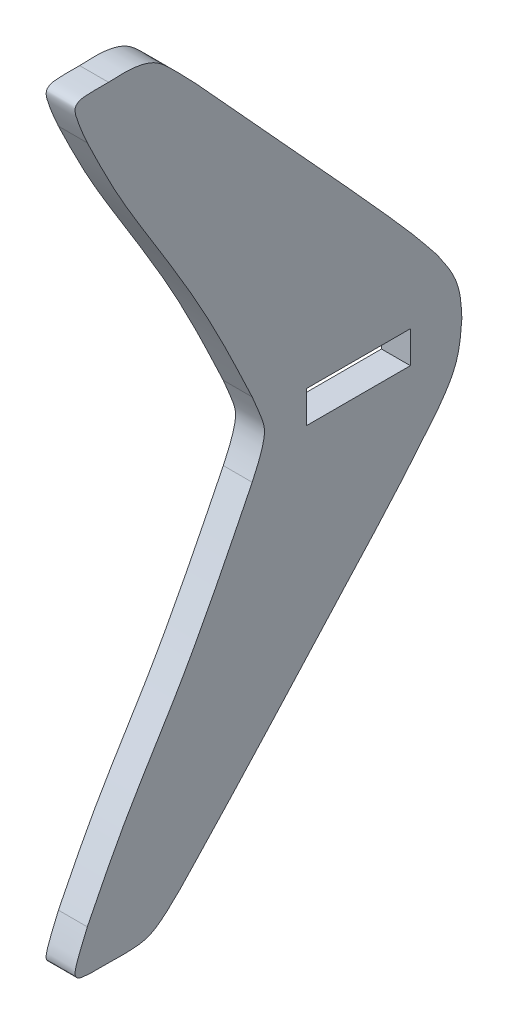
ISO-10303-21;
HEADER;
FILE_DESCRIPTION(('STEP AP214'),'2;1');
FILE_NAME('part.step','',(''),(''),'','','');
FILE_SCHEMA(('AUTOMOTIVE_DESIGN { 1 0 10303 214 1 1 1 1 }'));
ENDSEC;
DATA;
#1=APPLICATION_CONTEXT('core data for automotive mechanical design processes');
#2=APPLICATION_PROTOCOL_DEFINITION('international standard','automotive_design',2000,#1);
#3=PRODUCT_CONTEXT('',#1,'mechanical');
#4=PRODUCT('Part','Part','',(#3));
#5=PRODUCT_RELATED_PRODUCT_CATEGORY('part','',(#4));
#6=PRODUCT_DEFINITION_FORMATION('','',#4);
#7=PRODUCT_DEFINITION_CONTEXT('part definition',#1,'design');
#8=PRODUCT_DEFINITION('design','',#6,#7);
#9=PRODUCT_DEFINITION_SHAPE('','',#8);
#10=(LENGTH_UNIT() NAMED_UNIT(*) SI_UNIT(.MILLI.,.METRE.));
#11=(NAMED_UNIT(*) PLANE_ANGLE_UNIT() SI_UNIT($,.RADIAN.));
#12=(NAMED_UNIT(*) SI_UNIT($,.STERADIAN.) SOLID_ANGLE_UNIT());
#13=UNCERTAINTY_MEASURE_WITH_UNIT(LENGTH_MEASURE(1.E-05),#10,'distance_accuracy_value','');
#14=(GEOMETRIC_REPRESENTATION_CONTEXT(3) GLOBAL_UNCERTAINTY_ASSIGNED_CONTEXT((#13)) GLOBAL_UNIT_ASSIGNED_CONTEXT((#10,
#11,#12)) REPRESENTATION_CONTEXT('',''));
#15=CARTESIAN_POINT('',(0.,0.,0.));
#16=DIRECTION('',(0.,0.,1.));
#17=DIRECTION('',(1.,0.,0.));
#18=AXIS2_PLACEMENT_3D('',#15,#16,#17);
#19=CARTESIAN_POINT('',(2.7,-5.83093594704467E-06,-3.58855555751787));
#20=DIRECTION('',(0.,-1.62486991035192E-06,-0.99999999999868));
#21=DIRECTION('',(0.,0.99999999999868,-1.62486991035193E-06));
#22=AXIS2_PLACEMENT_3D('',#19,#20,#21);
#23=PLANE('',#22);
#24=DIRECTION('',(0.,-0.99999999999868,1.62486991035192E-06));
#25=VECTOR('',#24,1.);
#26=CARTESIAN_POINT('',(0.,-5.83093594704467E-06,-3.58855555751787));
#27=LINE('',#26,#25);
#28=CARTESIAN_POINT('',(0.,1.55675196931868,-3.58855808704678));
#29=VERTEX_POINT('',#28);
#30=CARTESIAN_POINT('',(0.,-1.44324803067736,-3.58855321243705));
#31=VERTEX_POINT('',#30);
#32=EDGE_CURVE('E315',#29,#31,#27,.T.);
#33=ORIENTED_EDGE('',*,*,#32,.F.);
#34=DIRECTION('',(-1.,0.,0.));
#35=VECTOR('',#34,1.);
#36=CARTESIAN_POINT('',(2.7,1.55675196931868,-3.58855808704678));
#37=LINE('',#36,#35);
#38=CARTESIAN_POINT('',(2.7,1.55675196931868,-3.58855808704678));
#39=VERTEX_POINT('',#38);
#40=EDGE_CURVE('E11',#39,#29,#37,.T.);
#41=ORIENTED_EDGE('',*,*,#40,.F.);
#42=DIRECTION('',(0.,-0.99999999999868,1.62486991035192E-06));
#43=VECTOR('',#42,1.);
#44=CARTESIAN_POINT('',(2.7,-5.83093594704467E-06,-3.58855555751787));
#45=LINE('',#44,#43);
#46=CARTESIAN_POINT('',(2.7,-1.44324803067736,-3.58855321243705));
#47=VERTEX_POINT('',#46);
#48=EDGE_CURVE('E192',#39,#47,#45,.T.);
#49=ORIENTED_EDGE('',*,*,#48,.T.);
#50=DIRECTION('',(-1.,0.,0.));
#51=VECTOR('',#50,1.);
#52=CARTESIAN_POINT('',(2.7,-1.44324803067736,-3.58855321243705));
#53=LINE('',#52,#51);
#54=EDGE_CURVE('E66',#47,#31,#53,.T.);
#55=ORIENTED_EDGE('',*,*,#54,.T.);
#56=EDGE_LOOP('',(#33,#41,#49,#55));
#57=FACE_BOUND('',#56,.T.);
#58=ADVANCED_FACE('F50',(#57),#23,.T.);
#59=CARTESIAN_POINT('',(2.7,1.5603480534542,-0.00156430237065756));
#60=DIRECTION('',(0.,-0.999999497462914,0.0010025337494892));
#61=DIRECTION('',(0.,-0.0010025337494892,-0.999999497462914));
#62=AXIS2_PLACEMENT_3D('',#59,#60,#61);
#63=PLANE('',#62);
#64=DIRECTION('',(0.,0.0010025337494892,0.999999497462914));
#65=VECTOR('',#64,1.);
#66=CARTESIAN_POINT('',(0.,1.5603480534542,-0.00156430237065756));
#67=LINE('',#66,#65);
#68=CARTESIAN_POINT('',(0.,1.54702739194864,-13.288553212437));
#69=VERTEX_POINT('',#68);
#70=EDGE_CURVE('E177',#69,#29,#67,.T.);
#71=ORIENTED_EDGE('',*,*,#70,.F.);
#72=DIRECTION('',(-1.,0.,0.));
#73=VECTOR('',#72,1.);
#74=CARTESIAN_POINT('',(2.7,1.54702739194864,-13.288553212437));
#75=LINE('',#74,#73);
#76=CARTESIAN_POINT('',(2.7,1.54702739194864,-13.288553212437));
#77=VERTEX_POINT('',#76);
#78=EDGE_CURVE('E56',#77,#69,#75,.T.);
#79=ORIENTED_EDGE('',*,*,#78,.F.);
#80=DIRECTION('',(0.,0.0010025337494892,0.999999497462914));
#81=VECTOR('',#80,1.);
#82=CARTESIAN_POINT('',(2.7,1.5603480534542,-0.00156430237065756));
#83=LINE('',#82,#81);
#84=EDGE_CURVE('E180',#77,#39,#83,.T.);
#85=ORIENTED_EDGE('',*,*,#84,.T.);
#86=ORIENTED_EDGE('',*,*,#40,.T.);
#87=EDGE_LOOP('',(#71,#79,#85,#86));
#88=FACE_BOUND('',#87,.T.);
#89=ADVANCED_FACE('F176',(#88),#63,.T.);
#90=CARTESIAN_POINT('',(2.7,0.,-13.288553212437));
#91=DIRECTION('',(0.,0.,1.));
#92=DIRECTION('',(1.,0.,0.));
#93=AXIS2_PLACEMENT_3D('',#90,#91,#92);
#94=PLANE('',#93);
#95=DIRECTION('',(0.,1.,0.));
#96=VECTOR('',#95,1.);
#97=CARTESIAN_POINT('',(0.,0.,-13.288553212437));
#98=LINE('',#97,#96);
#99=CARTESIAN_POINT('',(0.,-1.44324803067736,-13.288553212437));
#100=VERTEX_POINT('',#99);
#101=EDGE_CURVE('E319',#100,#69,#98,.T.);
#102=ORIENTED_EDGE('',*,*,#101,.F.);
#103=DIRECTION('',(-1.,0.,0.));
#104=VECTOR('',#103,1.);
#105=CARTESIAN_POINT('',(2.7,-1.44324803067736,-13.288553212437));
#106=LINE('',#105,#104);
#107=CARTESIAN_POINT('',(2.7,-1.44324803067736,-13.288553212437));
#108=VERTEX_POINT('',#107);
#109=EDGE_CURVE('E120',#108,#100,#106,.T.);
#110=ORIENTED_EDGE('',*,*,#109,.F.);
#111=DIRECTION('',(0.,1.,0.));
#112=VECTOR('',#111,1.);
#113=CARTESIAN_POINT('',(2.7,0.,-13.288553212437));
#114=LINE('',#113,#112);
#115=EDGE_CURVE('E189',#108,#77,#114,.T.);
#116=ORIENTED_EDGE('',*,*,#115,.T.);
#117=ORIENTED_EDGE('',*,*,#78,.T.);
#118=EDGE_LOOP('',(#102,#110,#116,#117));
#119=FACE_BOUND('',#118,.T.);
#120=ADVANCED_FACE('F191',(#119),#94,.T.);
#121=CARTESIAN_POINT('',(2.7,6.29343922792252,-15.7755224845044));
#122=CARTESIAN_POINT('',(2.7,5.12196214240405,-16.5936325073022));
#123=CARTESIAN_POINT('',(2.7,3.19413783871315,-17.9399434207116));
#124=CARTESIAN_POINT('',(2.7,0.87125498487653,-18.0568562266129));
#125=CARTESIAN_POINT('',(2.7,-0.0400863553463055,-18.1027248648197));
#126=B_SPLINE_CURVE_WITH_KNOTS('',3,(#121,#122,#123,#124,#125),.UNSPECIFIED.,.F.,.F.,(4,1,4),
(0.,0.607667972270947,1.),.UNSPECIFIED.);
#127=DIRECTION('',(-1.,0.,0.));
#128=VECTOR('',#127,1.);
#129=SURFACE_OF_LINEAR_EXTRUSION('',#126,#128);
#130=CARTESIAN_POINT('',(0.,6.29343922792252,-15.7755224845044));
#131=CARTESIAN_POINT('',(0.,5.12196214240405,-16.5936325073022));
#132=CARTESIAN_POINT('',(0.,3.19413783871315,-17.9399434207116));
#133=CARTESIAN_POINT('',(0.,0.87125498487653,-18.0568562266129));
#134=CARTESIAN_POINT('',(0.,-0.0400863553463055,-18.1027248648197));
#135=B_SPLINE_CURVE_WITH_KNOTS('',3,(#130,#131,#132,#133,#134),.UNSPECIFIED.,.F.,.F.,(4,1,4),
(0.,0.607667972270947,1.),.UNSPECIFIED.);
#136=CARTESIAN_POINT('',(0.,6.2934392279225,-15.7755224845044));
#137=VERTEX_POINT('',#136);
#138=CARTESIAN_POINT('',(0.,-0.0400863553463055,-18.1027248648197));
#139=VERTEX_POINT('',#138);
#140=EDGE_CURVE('E201',#137,#139,#135,.T.);
#141=ORIENTED_EDGE('',*,*,#140,.F.);
#142=DIRECTION('',(-1.,0.,0.));
#143=VECTOR('',#142,1.);
#144=CARTESIAN_POINT('',(2.7,6.2934392279225,-15.7755224845044));
#145=LINE('',#144,#143);
#146=CARTESIAN_POINT('',(2.7,6.2934392279225,-15.7755224845044));
#147=VERTEX_POINT('',#146);
#148=EDGE_CURVE('E55',#147,#137,#145,.T.);
#149=ORIENTED_EDGE('',*,*,#148,.F.);
#150=CARTESIAN_POINT('',(2.7,-0.0400863553463055,-18.1027248648197));
#151=VERTEX_POINT('',#150);
#152=EDGE_CURVE('E330',#147,#151,#126,.T.);
#153=ORIENTED_EDGE('',*,*,#152,.T.);
#154=DIRECTION('',(-1.,0.,0.));
#155=VECTOR('',#154,1.);
#156=CARTESIAN_POINT('',(2.7,-0.0400863553463055,-18.1027248648197));
#157=LINE('',#156,#155);
#158=EDGE_CURVE('E198',#151,#139,#157,.T.);
#159=ORIENTED_EDGE('',*,*,#158,.T.);
#160=EDGE_LOOP('',(#141,#149,#153,#159));
#161=FACE_BOUND('',#160,.T.);
#162=ADVANCED_FACE('F47',(#161),#129,.T.);
#163=CARTESIAN_POINT('',(2.7,15.8686335020383,-7.45162996259253));
#164=CARTESIAN_POINT('',(2.7,14.6607903775899,-8.53957417363261));
#165=CARTESIAN_POINT('',(2.7,12.5283757776615,-10.4602628061863));
#166=CARTESIAN_POINT('',(2.7,9.38651288634294,-13.2943660896936));
#167=CARTESIAN_POINT('',(2.7,7.35452937648754,-14.9243494111092));
#168=CARTESIAN_POINT('',(2.7,6.2934392279225,-15.7755224845044));
#169=B_SPLINE_CURVE_WITH_KNOTS('',3,(#163,#164,#165,#166,#167,#168),.UNSPECIFIED.,.F.,.F.,(4,1,
1,4),(0.,0.384322969824805,0.678495047705216,1.),.UNSPECIFIED.);
#170=DIRECTION('',(-1.,0.,0.));
#171=VECTOR('',#170,1.);
#172=SURFACE_OF_LINEAR_EXTRUSION('',#169,#171);
#173=CARTESIAN_POINT('',(0.,15.8686335020383,-7.45162996259253));
#174=CARTESIAN_POINT('',(0.,14.6607903775899,-8.53957417363261));
#175=CARTESIAN_POINT('',(0.,12.5283757776615,-10.4602628061863));
#176=CARTESIAN_POINT('',(0.,9.38651288634294,-13.2943660896936));
#177=CARTESIAN_POINT('',(0.,7.35452937648754,-14.9243494111092));
#178=CARTESIAN_POINT('',(0.,6.2934392279225,-15.7755224845044));
#179=B_SPLINE_CURVE_WITH_KNOTS('',3,(#173,#174,#175,#176,#177,#178),.UNSPECIFIED.,.F.,.F.,(4,1,
1,4),(0.,0.384322969824805,0.678495047705216,1.),.UNSPECIFIED.);
#180=CARTESIAN_POINT('',(0.,15.8686335020383,-7.45162996259253));
#181=VERTEX_POINT('',#180);
#182=EDGE_CURVE('E208',#181,#137,#179,.T.);
#183=ORIENTED_EDGE('',*,*,#182,.F.);
#184=DIRECTION('',(-1.,0.,0.));
#185=VECTOR('',#184,1.);
#186=CARTESIAN_POINT('',(2.7,15.8686335020383,-7.45162996259253));
#187=LINE('',#186,#185);
#188=CARTESIAN_POINT('',(2.7,15.8686335020383,-7.45162996259253));
#189=VERTEX_POINT('',#188);
#190=EDGE_CURVE('E363',#189,#181,#187,.T.);
#191=ORIENTED_EDGE('',*,*,#190,.F.);
#192=EDGE_CURVE('E371',#189,#147,#169,.T.);
#193=ORIENTED_EDGE('',*,*,#192,.T.);
#194=ORIENTED_EDGE('',*,*,#148,.T.);
#195=EDGE_LOOP('',(#183,#191,#193,#194));
#196=FACE_BOUND('',#195,.T.);
#197=ADVANCED_FACE('F375',(#196),#172,.T.);
#198=CARTESIAN_POINT('',(2.7,10.9361787528282,-11.9613419287629));
#199=DIRECTION('',(0.,-0.674772382307943,0.738025902034924));
#200=DIRECTION('',(0.,-0.738025902034924,-0.674772382307943));
#201=AXIS2_PLACEMENT_3D('',#198,#199,#200);
#202=PLANE('',#201);
#203=DIRECTION('',(0.,0.738025902034924,0.674772382307943));
#204=VECTOR('',#203,1.);
#205=CARTESIAN_POINT('',(0.,10.9361787528282,-11.9613419287629));
#206=LINE('',#205,#204);
#207=CARTESIAN_POINT('',(0.,31.4187586204113,6.76575040628057));
#208=VERTEX_POINT('',#207);
#209=EDGE_CURVE('E216',#181,#208,#206,.T.);
#210=ORIENTED_EDGE('',*,*,#209,.T.);
#211=DIRECTION('',(-1.,0.,0.));
#212=VECTOR('',#211,1.);
#213=CARTESIAN_POINT('',(2.7,31.4187586204113,6.76575040628057));
#214=LINE('',#213,#212);
#215=CARTESIAN_POINT('',(2.7,31.4187586204113,6.76575040628057));
#216=VERTEX_POINT('',#215);
#217=EDGE_CURVE('E361',#216,#208,#214,.T.);
#218=ORIENTED_EDGE('',*,*,#217,.F.);
#219=DIRECTION('',(0.,0.738025902034924,0.674772382307943));
#220=VECTOR('',#219,1.);
#221=CARTESIAN_POINT('',(2.7,10.9361787528282,-11.9613419287629));
#222=LINE('',#221,#220);
#223=EDGE_CURVE('E381',#189,#216,#222,.T.);
#224=ORIENTED_EDGE('',*,*,#223,.F.);
#225=ORIENTED_EDGE('',*,*,#190,.T.);
#226=EDGE_LOOP('',(#210,#218,#224,#225));
#227=FACE_BOUND('',#226,.T.);
#228=ADVANCED_FACE('F382',(#227),#202,.F.);
#229=CARTESIAN_POINT('',(2.7,35.592564916759,14.9148920371315));
#230=CARTESIAN_POINT('',(2.7,35.6371663596666,14.0397603055401));
#231=CARTESIAN_POINT('',(2.7,35.7130786446394,12.5502737538393));
#232=CARTESIAN_POINT('',(2.7,35.0999623520218,10.4246358647583));
#233=CARTESIAN_POINT('',(2.7,33.4403845971018,8.70407679622741));
#234=CARTESIAN_POINT('',(2.7,32.1938298833205,7.50888543733638));
#235=CARTESIAN_POINT('',(2.7,31.4187586204113,6.76575040628057));
#236=B_SPLINE_CURVE_WITH_KNOTS('',3,(#229,#230,#231,#232,#233,#234,#235),.UNSPECIFIED.,.F.,.F.,
(4,1,1,1,4),(0.,0.271148288938919,0.46149821256831,0.665175338177557,1.),.UNSPECIFIED.);
#237=DIRECTION('',(-1.,0.,0.));
#238=VECTOR('',#237,1.);
#239=SURFACE_OF_LINEAR_EXTRUSION('',#236,#238);
#240=CARTESIAN_POINT('',(0.,35.592564916759,14.9148920371315));
#241=CARTESIAN_POINT('',(0.,35.6371663596666,14.0397603055401));
#242=CARTESIAN_POINT('',(0.,35.7130786446394,12.5502737538393));
#243=CARTESIAN_POINT('',(0.,35.0999623520218,10.4246358647583));
#244=CARTESIAN_POINT('',(0.,33.4403845971018,8.70407679622741));
#245=CARTESIAN_POINT('',(0.,32.1938298833205,7.50888543733638));
#246=CARTESIAN_POINT('',(0.,31.4187586204113,6.76575040628057));
#247=B_SPLINE_CURVE_WITH_KNOTS('',3,(#240,#241,#242,#243,#244,#245,#246),.UNSPECIFIED.,.F.,.F.,
(4,1,1,1,4),(0.,0.271148288938919,0.46149821256831,0.665175338177557,1.),.UNSPECIFIED.);
#248=CARTESIAN_POINT('',(0.,35.592564916759,14.9148920371315));
#249=VERTEX_POINT('',#248);
#250=EDGE_CURVE('E224',#249,#208,#247,.T.);
#251=ORIENTED_EDGE('',*,*,#250,.F.);
#252=DIRECTION('',(-1.,0.,0.));
#253=VECTOR('',#252,1.);
#254=CARTESIAN_POINT('',(2.7,35.592564916759,14.9148920371315));
#255=LINE('',#254,#253);
#256=CARTESIAN_POINT('',(2.7,35.592564916759,14.9148920371315));
#257=VERTEX_POINT('',#256);
#258=EDGE_CURVE('E358',#257,#249,#255,.T.);
#259=ORIENTED_EDGE('',*,*,#258,.F.);
#260=EDGE_CURVE('E386',#257,#216,#236,.T.);
#261=ORIENTED_EDGE('',*,*,#260,.T.);
#262=ORIENTED_EDGE('',*,*,#217,.T.);
#263=EDGE_LOOP('',(#251,#259,#261,#262));
#264=FACE_BOUND('',#263,.T.);
#265=ADVANCED_FACE('F387',(#264),#239,.T.);
#266=CARTESIAN_POINT('',(2.7,31.6829795371479,16.8972751351803));
#267=CARTESIAN_POINT('',(2.7,32.5133287430386,17.2636850226738));
#268=CARTESIAN_POINT('',(2.7,33.5400089622371,17.716730296806));
#269=CARTESIAN_POINT('',(2.7,34.7194547242362,18.0631832381851));
#270=CARTESIAN_POINT('',(2.7,35.2073489569784,18.0277124159605));
#271=CARTESIAN_POINT('',(2.7,35.5035763279482,17.6324915082032));
#272=CARTESIAN_POINT('',(2.7,35.6135126779012,16.5672751523856));
#273=CARTESIAN_POINT('',(2.7,35.6017588600354,15.6402659753185));
#274=CARTESIAN_POINT('',(2.7,35.592564916759,14.9148920371315));
#275=B_SPLINE_CURVE_WITH_KNOTS('',3,(#266,#267,#268,#269,#270,#271,#272,#273,#274),
.UNSPECIFIED.,.F.,.F.,(4,1,1,1,1,1,4),(0.,0.394572903687361,0.487867264006061,0.536933984507631,
0.59528624391122,0.68331617598288,1.),.UNSPECIFIED.);
#276=DIRECTION('',(-1.,0.,0.));
#277=VECTOR('',#276,1.);
#278=SURFACE_OF_LINEAR_EXTRUSION('',#275,#277);
#279=CARTESIAN_POINT('',(0.,31.6829795371479,16.8972751351803));
#280=CARTESIAN_POINT('',(0.,32.5133287430386,17.2636850226738));
#281=CARTESIAN_POINT('',(0.,33.5400089622371,17.716730296806));
#282=CARTESIAN_POINT('',(0.,34.7194547242362,18.0631832381851));
#283=CARTESIAN_POINT('',(0.,35.2073489569784,18.0277124159605));
#284=CARTESIAN_POINT('',(0.,35.5035763279482,17.6324915082032));
#285=CARTESIAN_POINT('',(0.,35.6135126779012,16.5672751523856));
#286=CARTESIAN_POINT('',(0.,35.6017588600354,15.6402659753185));
#287=CARTESIAN_POINT('',(0.,35.592564916759,14.9148920371315));
#288=B_SPLINE_CURVE_WITH_KNOTS('',3,(#279,#280,#281,#282,#283,#284,#285,#286,#287),
.UNSPECIFIED.,.F.,.F.,(4,1,1,1,1,1,4),(0.,0.394572903687361,0.487867264006061,0.536933984507631,
0.59528624391122,0.68331617598288,1.),.UNSPECIFIED.);
#289=CARTESIAN_POINT('',(0.,31.6829795371479,16.8972751351803));
#290=VERTEX_POINT('',#289);
#291=EDGE_CURVE('E231',#290,#249,#288,.T.);
#292=ORIENTED_EDGE('',*,*,#291,.F.);
#293=DIRECTION('',(-1.,0.,0.));
#294=VECTOR('',#293,1.);
#295=CARTESIAN_POINT('',(2.7,31.6829795371479,16.8972751351803));
#296=LINE('',#295,#294);
#297=CARTESIAN_POINT('',(2.7,31.6829795371479,16.8972751351803));
#298=VERTEX_POINT('',#297);
#299=EDGE_CURVE('E352',#298,#290,#296,.T.);
#300=ORIENTED_EDGE('',*,*,#299,.F.);
#301=EDGE_CURVE('E392',#298,#257,#275,.T.);
#302=ORIENTED_EDGE('',*,*,#301,.T.);
#303=ORIENTED_EDGE('',*,*,#258,.T.);
#304=EDGE_LOOP('',(#292,#300,#302,#303));
#305=FACE_BOUND('',#304,.T.);
#306=ADVANCED_FACE('F413',(#305),#278,.T.);
#307=CARTESIAN_POINT('',(2.7,3.41018107957922,1.49063347752188));
#308=CARTESIAN_POINT('',(2.7,6.39223334869226,2.89511299579489));
#309=CARTESIAN_POINT('',(2.7,12.3104199114064,5.6824456990955));
#310=CARTESIAN_POINT('',(2.7,19.8462393428611,10.3087314343725));
#311=CARTESIAN_POINT('',(2.7,26.1812074512239,14.2337228207462));
#312=CARTESIAN_POINT('',(2.7,29.9672582649971,16.0666586557761));
#313=CARTESIAN_POINT('',(2.7,31.6829795371479,16.8972751351803));
#314=B_SPLINE_CURVE_WITH_KNOTS('',3,(#307,#308,#309,#310,#311,#312,#313),.UNSPECIFIED.,.F.,.F.,
(4,1,1,1,4),(0.,0.306659050800095,0.608596131119994,0.822630723137661,1.),.UNSPECIFIED.);
#315=DIRECTION('',(-1.,0.,0.));
#316=VECTOR('',#315,1.);
#317=SURFACE_OF_LINEAR_EXTRUSION('',#314,#316);
#318=CARTESIAN_POINT('',(0.,3.41018107957922,1.49063347752188));
#319=CARTESIAN_POINT('',(0.,6.39223334869226,2.89511299579489));
#320=CARTESIAN_POINT('',(0.,12.3104199114064,5.6824456990955));
#321=CARTESIAN_POINT('',(0.,19.8462393428611,10.3087314343725));
#322=CARTESIAN_POINT('',(0.,26.1812074512239,14.2337228207462));
#323=CARTESIAN_POINT('',(0.,29.9672582649971,16.0666586557761));
#324=CARTESIAN_POINT('',(0.,31.6829795371479,16.8972751351803));
#325=B_SPLINE_CURVE_WITH_KNOTS('',3,(#318,#319,#320,#321,#322,#323,#324),.UNSPECIFIED.,.F.,.F.,
(4,1,1,1,4),(0.,0.306659050800095,0.608596131119994,0.822630723137661,1.),.UNSPECIFIED.);
#326=CARTESIAN_POINT('',(0.,3.41018107957922,1.49063347752188));
#327=VERTEX_POINT('',#326);
#328=EDGE_CURVE('E238',#327,#290,#325,.T.);
#329=ORIENTED_EDGE('',*,*,#328,.F.);
#330=DIRECTION('',(-1.,0.,0.));
#331=VECTOR('',#330,1.);
#332=CARTESIAN_POINT('',(2.7,3.41018107957922,1.49063347752188));
#333=LINE('',#332,#331);
#334=CARTESIAN_POINT('',(2.7,3.41018107957922,1.49063347752188));
#335=VERTEX_POINT('',#334);
#336=EDGE_CURVE('E355',#335,#327,#333,.T.);
#337=ORIENTED_EDGE('',*,*,#336,.F.);
#338=EDGE_CURVE('E398',#335,#298,#314,.T.);
#339=ORIENTED_EDGE('',*,*,#338,.T.);
#340=ORIENTED_EDGE('',*,*,#299,.T.);
#341=EDGE_LOOP('',(#329,#337,#339,#340));
#342=FACE_BOUND('',#341,.T.);
#343=ADVANCED_FACE('F520',(#342),#317,.T.);
#344=CARTESIAN_POINT('',(2.7,-3.49028732340142,1.49063347752188));
#345=CARTESIAN_POINT('',(2.7,-2.73906901579856,1.1467428094105));
#346=CARTESIAN_POINT('',(2.7,-1.55235015516086,0.603489885839822));
#347=CARTESIAN_POINT('',(2.7,0.20664355770932,0.218203753429799));
#348=CARTESIAN_POINT('',(2.7,1.74699298411778,0.788773892865025));
#349=CARTESIAN_POINT('',(2.7,2.77424938421944,1.22227831792685));
#350=CARTESIAN_POINT('',(2.7,3.41018107957922,1.49063347752188));
#351=B_SPLINE_CURVE_WITH_KNOTS('',3,(#344,#345,#346,#347,#348,#349,#350),.UNSPECIFIED.,.F.,.F.,
(4,1,1,1,4),(0.,0.341130866671338,0.538893194331703,0.714557953110102,1.),.UNSPECIFIED.);
#352=DIRECTION('',(-1.,0.,0.));
#353=VECTOR('',#352,1.);
#354=SURFACE_OF_LINEAR_EXTRUSION('',#351,#353);
#355=CARTESIAN_POINT('',(0.,-3.49028732340142,1.49063347752188));
#356=CARTESIAN_POINT('',(0.,-2.73906901579856,1.1467428094105));
#357=CARTESIAN_POINT('',(0.,-1.55235015516086,0.603489885839822));
#358=CARTESIAN_POINT('',(0.,0.20664355770932,0.218203753429799));
#359=CARTESIAN_POINT('',(0.,1.74699298411778,0.788773892865025));
#360=CARTESIAN_POINT('',(0.,2.77424938421944,1.22227831792685));
#361=CARTESIAN_POINT('',(0.,3.41018107957922,1.49063347752188));
#362=B_SPLINE_CURVE_WITH_KNOTS('',3,(#355,#356,#357,#358,#359,#360,#361),.UNSPECIFIED.,.F.,.F.,
(4,1,1,1,4),(0.,0.341130866671338,0.538893194331703,0.714557953110102,1.),.UNSPECIFIED.);
#363=CARTESIAN_POINT('',(0.,-3.49028732340142,1.49063347752188));
#364=VERTEX_POINT('',#363);
#365=EDGE_CURVE('E249',#364,#327,#362,.T.);
#366=ORIENTED_EDGE('',*,*,#365,.F.);
#367=DIRECTION('',(-1.,0.,0.));
#368=VECTOR('',#367,1.);
#369=CARTESIAN_POINT('',(2.7,-3.49028732340142,1.49063347752188));
#370=LINE('',#369,#368);
#371=CARTESIAN_POINT('',(2.7,-3.49028732340142,1.49063347752188));
#372=VERTEX_POINT('',#371);
#373=EDGE_CURVE('E350',#372,#364,#370,.T.);
#374=ORIENTED_EDGE('',*,*,#373,.F.);
#375=EDGE_CURVE('E519',#372,#335,#351,.T.);
#376=ORIENTED_EDGE('',*,*,#375,.T.);
#377=ORIENTED_EDGE('',*,*,#336,.T.);
#378=EDGE_LOOP('',(#366,#374,#376,#377));
#379=FACE_BOUND('',#378,.T.);
#380=ADVANCED_FACE('F513',(#379),#354,.T.);
#381=CARTESIAN_POINT('',(2.7,-31.7632130911875,16.8972751351803));
#382=CARTESIAN_POINT('',(2.7,-29.5258226171754,15.7812697317115));
#383=CARTESIAN_POINT('',(2.7,-24.5416577239396,13.2951793432706));
#384=CARTESIAN_POINT('',(2.7,-15.5272639626889,7.42929158238477));
#385=CARTESIAN_POINT('',(2.7,-8.13196669504264,3.78067576505686));
#386=CARTESIAN_POINT('',(2.7,-3.49028732340142,1.49063347752188));
#387=B_SPLINE_CURVE_WITH_KNOTS('',3,(#381,#382,#383,#384,#385,#386),.UNSPECIFIED.,.F.,.F.,(4,1,
1,4),(0.,0.232717521729957,0.518417556220028,1.),.UNSPECIFIED.);
#388=DIRECTION('',(-1.,0.,0.));
#389=VECTOR('',#388,1.);
#390=SURFACE_OF_LINEAR_EXTRUSION('',#387,#389);
#391=CARTESIAN_POINT('',(0.,-31.7632130911875,16.8972751351803));
#392=CARTESIAN_POINT('',(0.,-29.5258226171754,15.7812697317115));
#393=CARTESIAN_POINT('',(0.,-24.5416577239396,13.2951793432706));
#394=CARTESIAN_POINT('',(0.,-15.5272639626889,7.42929158238477));
#395=CARTESIAN_POINT('',(0.,-8.13196669504264,3.78067576505686));
#396=CARTESIAN_POINT('',(0.,-3.49028732340142,1.49063347752188));
#397=B_SPLINE_CURVE_WITH_KNOTS('',3,(#391,#392,#393,#394,#395,#396),.UNSPECIFIED.,.F.,.F.,(4,1,
1,4),(0.,0.232717521729957,0.518417556220028,1.),.UNSPECIFIED.);
#398=CARTESIAN_POINT('',(0.,-31.7632130911875,16.8972751351803));
#399=VERTEX_POINT('',#398);
#400=EDGE_CURVE('E256',#399,#364,#397,.T.);
#401=ORIENTED_EDGE('',*,*,#400,.F.);
#402=DIRECTION('',(-1.,0.,0.));
#403=VECTOR('',#402,1.);
#404=CARTESIAN_POINT('',(2.7,-31.7632130911875,16.8972751351803));
#405=LINE('',#404,#403);
#406=CARTESIAN_POINT('',(2.7,-31.7632130911875,16.8972751351803));
#407=VERTEX_POINT('',#406);
#408=EDGE_CURVE('E348',#407,#399,#405,.T.);
#409=ORIENTED_EDGE('',*,*,#408,.F.);
#410=EDGE_CURVE('E497',#407,#372,#387,.T.);
#411=ORIENTED_EDGE('',*,*,#410,.T.);
#412=ORIENTED_EDGE('',*,*,#373,.T.);
#413=EDGE_LOOP('',(#401,#409,#411,#412));
#414=FACE_BOUND('',#413,.T.);
#415=ADVANCED_FACE('F508',(#414),#390,.T.);
#416=CARTESIAN_POINT('',(2.7,-35.6727189019127,14.9148920371315));
#417=CARTESIAN_POINT('',(2.7,-35.6806890937143,15.639451674277));
#418=CARTESIAN_POINT('',(2.7,-35.6908747908657,16.5654199841849));
#419=CARTESIAN_POINT('',(2.7,-35.5860548836311,17.634008996227));
#420=CARTESIAN_POINT('',(2.7,-35.2211948235805,18.1027248648197));
#421=CARTESIAN_POINT('',(2.7,-34.5506771819906,18.0073625412323));
#422=CARTESIAN_POINT('',(2.7,-33.4259989245651,17.6083514168045));
#423=CARTESIAN_POINT('',(2.7,-32.4722002467748,17.2004662398683));
#424=CARTESIAN_POINT('',(2.7,-31.7632130911875,16.8972751351803));
#425=B_SPLINE_CURVE_WITH_KNOTS('',3,(#416,#417,#418,#419,#420,#421,#422,#423,#424),
.UNSPECIFIED.,.F.,.F.,(4,1,1,1,1,1,4),(0.,0.316944263161102,0.405046498105368,0.463446105328815,
0.551890515709594,0.66690917629387,1.),.UNSPECIFIED.);
#426=DIRECTION('',(-1.,0.,0.));
#427=VECTOR('',#426,1.);
#428=SURFACE_OF_LINEAR_EXTRUSION('',#425,#427);
#429=CARTESIAN_POINT('',(0.,-35.6727189019127,14.9148920371315));
#430=CARTESIAN_POINT('',(0.,-35.6806890937143,15.639451674277));
#431=CARTESIAN_POINT('',(0.,-35.6908747908657,16.5654199841849));
#432=CARTESIAN_POINT('',(0.,-35.5860548836311,17.634008996227));
#433=CARTESIAN_POINT('',(0.,-35.2211948235805,18.1027248648197));
#434=CARTESIAN_POINT('',(0.,-34.5506771819906,18.0073625412323));
#435=CARTESIAN_POINT('',(0.,-33.4259989245651,17.6083514168045));
#436=CARTESIAN_POINT('',(0.,-32.4722002467748,17.2004662398683));
#437=CARTESIAN_POINT('',(0.,-31.7632130911875,16.8972751351803));
#438=B_SPLINE_CURVE_WITH_KNOTS('',3,(#429,#430,#431,#432,#433,#434,#435,#436,#437),
.UNSPECIFIED.,.F.,.F.,(4,1,1,1,1,1,4),(0.,0.316944263161102,0.405046498105368,0.463446105328815,
0.551890515709594,0.66690917629387,1.),.UNSPECIFIED.);
#439=CARTESIAN_POINT('',(0.,-35.6727189019127,14.9148920371315));
#440=VERTEX_POINT('',#439);
#441=EDGE_CURVE('E270',#440,#399,#438,.T.);
#442=ORIENTED_EDGE('',*,*,#441,.F.);
#443=DIRECTION('',(-1.,0.,0.));
#444=VECTOR('',#443,1.);
#445=CARTESIAN_POINT('',(2.7,-35.6727189019127,14.9148920371315));
#446=LINE('',#445,#444);
#447=CARTESIAN_POINT('',(2.7,-35.6727189019127,14.9148920371315));
#448=VERTEX_POINT('',#447);
#449=EDGE_CURVE('E344',#448,#440,#446,.T.);
#450=ORIENTED_EDGE('',*,*,#449,.F.);
#451=EDGE_CURVE('E489',#448,#407,#425,.T.);
#452=ORIENTED_EDGE('',*,*,#451,.T.);
#453=ORIENTED_EDGE('',*,*,#408,.T.);
#454=EDGE_LOOP('',(#442,#450,#452,#453));
#455=FACE_BOUND('',#454,.T.);
#456=ADVANCED_FACE('F510',(#455),#428,.T.);
#457=CARTESIAN_POINT('',(2.7,-31.4989170798855,6.76575040623016));
#458=CARTESIAN_POINT('',(2.7,-32.4388225406612,7.63546647462482));
#459=CARTESIAN_POINT('',(2.7,-33.8944270245385,8.98237067051121));
#460=CARTESIAN_POINT('',(2.7,-35.507559416972,11.0078334318953));
#461=CARTESIAN_POINT('',(2.7,-35.7130786446394,12.9754722229113));
#462=CARTESIAN_POINT('',(2.7,-35.6877238334385,14.1943215525572));
#463=CARTESIAN_POINT('',(2.7,-35.6727189019127,14.9148920371315));
#464=B_SPLINE_CURVE_WITH_KNOTS('',3,(#457,#458,#459,#460,#461,#462,#463),.UNSPECIFIED.,.F.,.F.,
(4,1,1,1,4),(0.,0.400367919755244,0.620038252267807,0.775370741876175,1.),.UNSPECIFIED.);
#465=DIRECTION('',(-1.,0.,0.));
#466=VECTOR('',#465,1.);
#467=SURFACE_OF_LINEAR_EXTRUSION('',#464,#466);
#468=CARTESIAN_POINT('',(0.,-31.4989170798855,6.76575040623016));
#469=CARTESIAN_POINT('',(0.,-32.4388225406612,7.63546647462482));
#470=CARTESIAN_POINT('',(0.,-33.8944270245385,8.98237067051121));
#471=CARTESIAN_POINT('',(0.,-35.507559416972,11.0078334318953));
#472=CARTESIAN_POINT('',(0.,-35.7130786446394,12.9754722229113));
#473=CARTESIAN_POINT('',(0.,-35.6877238334385,14.1943215525572));
#474=CARTESIAN_POINT('',(0.,-35.6727189019127,14.9148920371315));
#475=B_SPLINE_CURVE_WITH_KNOTS('',3,(#468,#469,#470,#471,#472,#473,#474),.UNSPECIFIED.,.F.,.F.,
(4,1,1,1,4),(0.,0.400367919755244,0.620038252267807,0.775370741876175,1.),.UNSPECIFIED.);
#476=CARTESIAN_POINT('',(0.,-31.4989170798855,6.76575040623016));
#477=VERTEX_POINT('',#476);
#478=EDGE_CURVE('E276',#477,#440,#475,.T.);
#479=ORIENTED_EDGE('',*,*,#478,.F.);
#480=DIRECTION('',(-1.,0.,0.));
#481=VECTOR('',#480,1.);
#482=CARTESIAN_POINT('',(2.7,-31.4989170798855,6.76575040623016));
#483=LINE('',#482,#481);
#484=CARTESIAN_POINT('',(2.7,-31.4989170798855,6.76575040623016));
#485=VERTEX_POINT('',#484);
#486=EDGE_CURVE('E338',#485,#477,#483,.T.);
#487=ORIENTED_EDGE('',*,*,#486,.F.);
#488=EDGE_CURVE('E478',#485,#448,#464,.T.);
#489=ORIENTED_EDGE('',*,*,#488,.T.);
#490=ORIENTED_EDGE('',*,*,#449,.T.);
#491=EDGE_LOOP('',(#479,#487,#489,#490));
#492=FACE_BOUND('',#491,.T.);
#493=ADVANCED_FACE('F470',(#492),#467,.T.);
#494=CARTESIAN_POINT('',(2.7,-15.9488015420923,-7.4516299625903));
#495=CARTESIAN_POINT('',(2.7,-17.4433884631866,-6.10218115983468));
#496=CARTESIAN_POINT('',(2.7,-20.530431809089,-3.31491807838555));
#497=CARTESIAN_POINT('',(2.7,-24.7702746289526,0.536312590781499));
#498=CARTESIAN_POINT('',(2.7,-28.4672946336481,3.91728883830259));
#499=CARTESIAN_POINT('',(2.7,-30.554741005938,5.87860919428245));
#500=CARTESIAN_POINT('',(2.7,-31.4989170798855,6.76575040623016));
#501=B_SPLINE_CURVE_WITH_KNOTS('',3,(#494,#495,#496,#497,#498,#499,#500),.UNSPECIFIED.,.F.,.F.,
(4,1,1,1,4),(0.,0.286704656975059,0.592183493019002,0.815537105321755,1.),.UNSPECIFIED.);
#502=DIRECTION('',(-1.,0.,0.));
#503=VECTOR('',#502,1.);
#504=SURFACE_OF_LINEAR_EXTRUSION('',#501,#503);
#505=CARTESIAN_POINT('',(0.,-15.9488015420923,-7.4516299625903));
#506=CARTESIAN_POINT('',(0.,-17.4433884631866,-6.10218115983468));
#507=CARTESIAN_POINT('',(0.,-20.530431809089,-3.31491807838555));
#508=CARTESIAN_POINT('',(0.,-24.7702746289526,0.536312590781499));
#509=CARTESIAN_POINT('',(0.,-28.4672946336481,3.91728883830259));
#510=CARTESIAN_POINT('',(0.,-30.554741005938,5.87860919428245));
#511=CARTESIAN_POINT('',(0.,-31.4989170798855,6.76575040623016));
#512=B_SPLINE_CURVE_WITH_KNOTS('',3,(#505,#506,#507,#508,#509,#510,#511),.UNSPECIFIED.,.F.,.F.,
(4,1,1,1,4),(0.,0.286704656975059,0.592183493019002,0.815537105321755,1.),.UNSPECIFIED.);
#513=CARTESIAN_POINT('',(0.,-15.9488015420923,-7.4516299625903));
#514=VERTEX_POINT('',#513);
#515=EDGE_CURVE('E283',#514,#477,#512,.T.);
#516=ORIENTED_EDGE('',*,*,#515,.F.);
#517=DIRECTION('',(-1.,0.,0.));
#518=VECTOR('',#517,1.);
#519=CARTESIAN_POINT('',(2.7,-15.9488015420923,-7.4516299625903));
#520=LINE('',#519,#518);
#521=CARTESIAN_POINT('',(2.7,-15.9488015420923,-7.4516299625903));
#522=VERTEX_POINT('',#521);
#523=EDGE_CURVE('E340',#522,#514,#520,.T.);
#524=ORIENTED_EDGE('',*,*,#523,.F.);
#525=EDGE_CURVE('E444',#522,#485,#501,.T.);
#526=ORIENTED_EDGE('',*,*,#525,.T.);
#527=ORIENTED_EDGE('',*,*,#486,.T.);
#528=EDGE_LOOP('',(#516,#524,#526,#527));
#529=FACE_BOUND('',#528,.T.);
#530=ADVANCED_FACE('F466',(#529),#504,.T.);
#531=CARTESIAN_POINT('',(2.7,-6.37354547174474,-15.7755224845044));
#532=CARTESIAN_POINT('',(2.7,-7.80486235287353,-14.6012381408974));
#533=CARTESIAN_POINT('',(2.7,-11.0755857200053,-11.9178636254907));
#534=CARTESIAN_POINT('',(2.7,-14.194675957815,-9.05926409394302));
#535=CARTESIAN_POINT('',(2.7,-15.9488015420923,-7.4516299625903));
#536=B_SPLINE_CURVE_WITH_KNOTS('',3,(#531,#532,#533,#534,#535),.UNSPECIFIED.,.F.,.F.,(4,1,4),
(0.,0.437614778281897,1.),.UNSPECIFIED.);
#537=DIRECTION('',(-1.,0.,0.));
#538=VECTOR('',#537,1.);
#539=SURFACE_OF_LINEAR_EXTRUSION('',#536,#538);
#540=CARTESIAN_POINT('',(0.,-6.37354547174474,-15.7755224845044));
#541=CARTESIAN_POINT('',(0.,-7.80486235287353,-14.6012381408974));
#542=CARTESIAN_POINT('',(0.,-11.0755857200053,-11.9178636254907));
#543=CARTESIAN_POINT('',(0.,-14.194675957815,-9.05926409394302));
#544=CARTESIAN_POINT('',(0.,-15.9488015420923,-7.4516299625903));
#545=B_SPLINE_CURVE_WITH_KNOTS('',3,(#540,#541,#542,#543,#544),.UNSPECIFIED.,.F.,.F.,(4,1,4),
(0.,0.437614778281897,1.),.UNSPECIFIED.);
#546=CARTESIAN_POINT('',(0.,-6.37354547174474,-15.7755224845044));
#547=VERTEX_POINT('',#546);
#548=EDGE_CURVE('E294',#547,#514,#545,.T.);
#549=ORIENTED_EDGE('',*,*,#548,.F.);
#550=DIRECTION('',(-1.,0.,0.));
#551=VECTOR('',#550,1.);
#552=CARTESIAN_POINT('',(2.7,-6.37354547174474,-15.7755224845044));
#553=LINE('',#552,#551);
#554=CARTESIAN_POINT('',(2.7,-6.37354547174474,-15.7755224845044));
#555=VERTEX_POINT('',#554);
#556=EDGE_CURVE('E333',#555,#547,#553,.T.);
#557=ORIENTED_EDGE('',*,*,#556,.F.);
#558=EDGE_CURVE('E436',#555,#522,#536,.T.);
#559=ORIENTED_EDGE('',*,*,#558,.T.);
#560=ORIENTED_EDGE('',*,*,#523,.T.);
#561=EDGE_LOOP('',(#549,#557,#559,#560));
#562=FACE_BOUND('',#561,.T.);
#563=ADVANCED_FACE('F465',(#562),#539,.T.);
#564=CARTESIAN_POINT('',(2.7,-0.0400863553463055,-18.1027248648197));
#565=CARTESIAN_POINT('',(2.7,-1.20197465447172,-18.0098290966687));
#566=CARTESIAN_POINT('',(2.7,-3.52960922998013,-17.8237293309723));
#567=CARTESIAN_POINT('',(2.7,-5.42456060358071,-16.4590115419911));
#568=CARTESIAN_POINT('',(2.7,-6.37354547174474,-15.7755224845044));
#569=B_SPLINE_CURVE_WITH_KNOTS('',3,(#564,#565,#566,#567,#568),.UNSPECIFIED.,.F.,.F.,(4,1,4),
(0.,0.499171870546934,1.),.UNSPECIFIED.);
#570=DIRECTION('',(-1.,0.,0.));
#571=VECTOR('',#570,1.);
#572=SURFACE_OF_LINEAR_EXTRUSION('',#569,#571);
#573=CARTESIAN_POINT('',(0.,-0.0400863553463055,-18.1027248648197));
#574=CARTESIAN_POINT('',(0.,-1.20197465447172,-18.0098290966687));
#575=CARTESIAN_POINT('',(0.,-3.52960922998013,-17.8237293309723));
#576=CARTESIAN_POINT('',(0.,-5.42456060358071,-16.4590115419911));
#577=CARTESIAN_POINT('',(0.,-6.37354547174474,-15.7755224845044));
#578=B_SPLINE_CURVE_WITH_KNOTS('',3,(#573,#574,#575,#576,#577),.UNSPECIFIED.,.F.,.F.,(4,1,4),
(0.,0.499171870546934,1.),.UNSPECIFIED.);
#579=EDGE_CURVE('E301',#139,#547,#578,.T.);
#580=ORIENTED_EDGE('',*,*,#579,.F.);
#581=ORIENTED_EDGE('',*,*,#158,.F.);
#582=EDGE_CURVE('E435',#151,#555,#569,.T.);
#583=ORIENTED_EDGE('',*,*,#582,.T.);
#584=ORIENTED_EDGE('',*,*,#556,.T.);
#585=EDGE_LOOP('',(#580,#581,#583,#584));
#586=FACE_BOUND('',#585,.T.);
#587=ADVANCED_FACE('F460',(#586),#572,.T.);
#588=CARTESIAN_POINT('',(2.7,-1.44324803067736,0.));
#589=DIRECTION('',(0.,1.,0.));
#590=DIRECTION('',(0.,0.,1.));
#591=AXIS2_PLACEMENT_3D('',#588,#589,#590);
#592=PLANE('',#591);
#593=DIRECTION('',(0.,0.,-1.));
#594=VECTOR('',#593,1.);
#595=CARTESIAN_POINT('',(0.,-1.44324803067736,0.));
#596=LINE('',#595,#594);
#597=EDGE_CURVE('E322',#31,#100,#596,.T.);
#598=ORIENTED_EDGE('',*,*,#597,.F.);
#599=ORIENTED_EDGE('',*,*,#54,.F.);
#600=DIRECTION('',(0.,0.,-1.));
#601=VECTOR('',#600,1.);
#602=CARTESIAN_POINT('',(2.7,-1.44324803067736,0.));
#603=LINE('',#602,#601);
#604=EDGE_CURVE('E196',#47,#108,#603,.T.);
#605=ORIENTED_EDGE('',*,*,#604,.T.);
#606=ORIENTED_EDGE('',*,*,#109,.T.);
#607=EDGE_LOOP('',(#598,#599,#605,#606));
#608=FACE_BOUND('',#607,.T.);
#609=ADVANCED_FACE('F462',(#608),#592,.T.);
#610=CARTESIAN_POINT('',(2.7,0.,0.));
#611=DIRECTION('',(1.,0.,0.));
#612=DIRECTION('',(0.,0.,-1.));
#613=AXIS2_PLACEMENT_3D('',#610,#611,#612);
#614=PLANE('',#613);
#615=ORIENTED_EDGE('',*,*,#152,.F.);
#616=ORIENTED_EDGE('',*,*,#192,.F.);
#617=ORIENTED_EDGE('',*,*,#223,.T.);
#618=ORIENTED_EDGE('',*,*,#260,.F.);
#619=ORIENTED_EDGE('',*,*,#301,.F.);
#620=ORIENTED_EDGE('',*,*,#338,.F.);
#621=ORIENTED_EDGE('',*,*,#375,.F.);
#622=ORIENTED_EDGE('',*,*,#410,.F.);
#623=ORIENTED_EDGE('',*,*,#451,.F.);
#624=ORIENTED_EDGE('',*,*,#488,.F.);
#625=ORIENTED_EDGE('',*,*,#525,.F.);
#626=ORIENTED_EDGE('',*,*,#558,.F.);
#627=ORIENTED_EDGE('',*,*,#582,.F.);
#628=EDGE_LOOP('',(#615,#616,#617,#618,#619,#620,#621,#622,#623,#624,#625,#626,#627));
#629=FACE_BOUND('',#628,.T.);
#630=ORIENTED_EDGE('',*,*,#48,.F.);
#631=ORIENTED_EDGE('',*,*,#84,.F.);
#632=ORIENTED_EDGE('',*,*,#115,.F.);
#633=ORIENTED_EDGE('',*,*,#604,.F.);
#634=EDGE_LOOP('',(#630,#631,#632,#633));
#635=FACE_BOUND('',#634,.T.);
#636=ADVANCED_FACE('F187',(#629,#635),#614,.T.);
#637=CARTESIAN_POINT('',(0.,0.,0.));
#638=DIRECTION('',(1.,0.,0.));
#639=DIRECTION('',(0.,0.,-1.));
#640=AXIS2_PLACEMENT_3D('',#637,#638,#639);
#641=PLANE('',#640);
#642=ORIENTED_EDGE('',*,*,#140,.T.);
#643=ORIENTED_EDGE('',*,*,#579,.T.);
#644=ORIENTED_EDGE('',*,*,#548,.T.);
#645=ORIENTED_EDGE('',*,*,#515,.T.);
#646=ORIENTED_EDGE('',*,*,#478,.T.);
#647=ORIENTED_EDGE('',*,*,#441,.T.);
#648=ORIENTED_EDGE('',*,*,#400,.T.);
#649=ORIENTED_EDGE('',*,*,#365,.T.);
#650=ORIENTED_EDGE('',*,*,#328,.T.);
#651=ORIENTED_EDGE('',*,*,#291,.T.);
#652=ORIENTED_EDGE('',*,*,#250,.T.);
#653=ORIENTED_EDGE('',*,*,#209,.F.);
#654=ORIENTED_EDGE('',*,*,#182,.T.);
#655=EDGE_LOOP('',(#642,#643,#644,#645,#646,#647,#648,#649,#650,#651,#652,#653,#654));
#656=FACE_BOUND('',#655,.T.);
#657=ORIENTED_EDGE('',*,*,#32,.T.);
#658=ORIENTED_EDGE('',*,*,#597,.T.);
#659=ORIENTED_EDGE('',*,*,#101,.T.);
#660=ORIENTED_EDGE('',*,*,#70,.T.);
#661=EDGE_LOOP('',(#657,#658,#659,#660));
#662=FACE_BOUND('',#661,.T.);
#663=ADVANCED_FACE('F377',(#656,#662),#641,.F.);
#664=CLOSED_SHELL('',(#58,#89,#120,#162,#197,#228,#265,#306,#343,#380,#415,#456,#493,#530,#563,
#587,#609,#636,#663));
#665=MANIFOLD_SOLID_BREP('B2',#664);
#666=ADVANCED_BREP_SHAPE_REPRESENTATION('',(#18,#665),#14);
#667=SHAPE_DEFINITION_REPRESENTATION(#9,#666);
ENDSEC;
END-ISO-10303-21;
